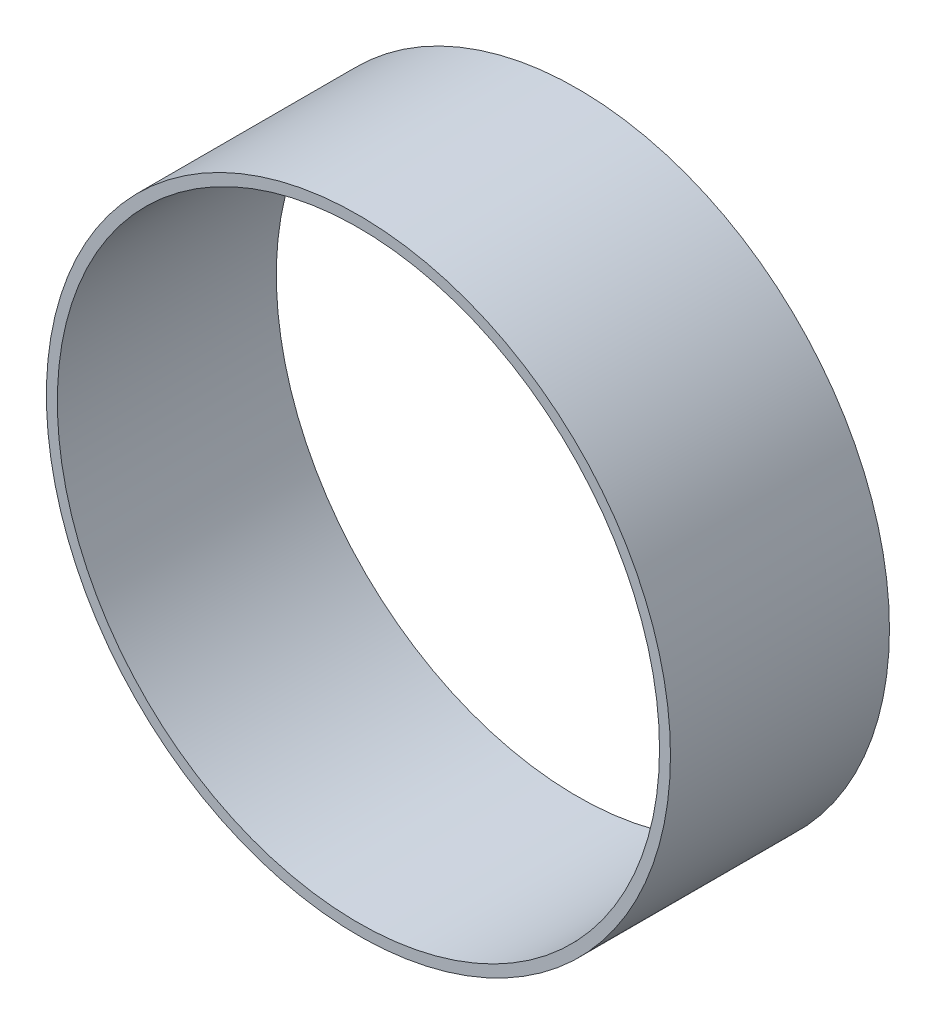
ISO-10303-21;
HEADER;
FILE_DESCRIPTION(('STEP AP214'),'2;1');
FILE_NAME('part.step','',(''),(''),'','','');
FILE_SCHEMA(('AUTOMOTIVE_DESIGN { 1 0 10303 214 1 1 1 1 }'));
ENDSEC;
DATA;
#1=APPLICATION_CONTEXT('core data for automotive mechanical design processes');
#2=APPLICATION_PROTOCOL_DEFINITION('international standard','automotive_design',2000,#1);
#3=PRODUCT_CONTEXT('',#1,'mechanical');
#4=PRODUCT('Part','Part','',(#3));
#5=PRODUCT_RELATED_PRODUCT_CATEGORY('part','',(#4));
#6=PRODUCT_DEFINITION_FORMATION('','',#4);
#7=PRODUCT_DEFINITION_CONTEXT('part definition',#1,'design');
#8=PRODUCT_DEFINITION('design','',#6,#7);
#9=PRODUCT_DEFINITION_SHAPE('','',#8);
#10=(LENGTH_UNIT() NAMED_UNIT(*) SI_UNIT(.MILLI.,.METRE.));
#11=(NAMED_UNIT(*) PLANE_ANGLE_UNIT() SI_UNIT($,.RADIAN.));
#12=(NAMED_UNIT(*) SI_UNIT($,.STERADIAN.) SOLID_ANGLE_UNIT());
#13=UNCERTAINTY_MEASURE_WITH_UNIT(LENGTH_MEASURE(1.E-05),#10,'distance_accuracy_value','');
#14=(GEOMETRIC_REPRESENTATION_CONTEXT(3) GLOBAL_UNCERTAINTY_ASSIGNED_CONTEXT((#13)) GLOBAL_UNIT_ASSIGNED_CONTEXT((#10,
#11,#12)) REPRESENTATION_CONTEXT('',''));
#15=CARTESIAN_POINT('',(0.,0.,0.));
#16=DIRECTION('',(0.,0.,1.));
#17=DIRECTION('',(1.,0.,0.));
#18=AXIS2_PLACEMENT_3D('',#15,#16,#17);
#19=CARTESIAN_POINT('',(0.,0.,40.));
#20=DIRECTION('',(0.,0.,1.));
#21=DIRECTION('',(1.,0.,0.));
#22=AXIS2_PLACEMENT_3D('',#19,#20,#21);
#23=PLANE('',#22);
#24=CARTESIAN_POINT('',(0.,0.,40.));
#25=DIRECTION('',(0.,0.,1.));
#26=DIRECTION('',(1.,0.,0.));
#27=AXIS2_PLACEMENT_3D('',#24,#25,#26);
#28=CIRCLE('',#27,57.);
#29=CARTESIAN_POINT('',(57.,0.,40.));
#30=VERTEX_POINT('',#29);
#31=EDGE_CURVE('E10',#30,#30,#28,.T.);
#32=ORIENTED_EDGE('',*,*,#31,.T.);
#33=EDGE_LOOP('',(#32));
#34=FACE_BOUND('',#33,.T.);
#35=CARTESIAN_POINT('',(0.,0.,40.));
#36=DIRECTION('',(0.,0.,1.));
#37=DIRECTION('',(1.,0.,0.));
#38=AXIS2_PLACEMENT_3D('',#35,#36,#37);
#39=CIRCLE('',#38,55.);
#40=CARTESIAN_POINT('',(55.,0.,40.));
#41=VERTEX_POINT('',#40);
#42=EDGE_CURVE('E42',#41,#41,#39,.T.);
#43=ORIENTED_EDGE('',*,*,#42,.F.);
#44=EDGE_LOOP('',(#43));
#45=FACE_BOUND('',#44,.T.);
#46=ADVANCED_FACE('F31',(#34,#45),#23,.T.);
#47=CARTESIAN_POINT('',(0.,0.,0.));
#48=DIRECTION('',(0.,0.,1.));
#49=DIRECTION('',(1.,0.,0.));
#50=AXIS2_PLACEMENT_3D('',#47,#48,#49);
#51=PLANE('',#50);
#52=CARTESIAN_POINT('',(0.,0.,0.));
#53=DIRECTION('',(0.,0.,1.));
#54=DIRECTION('',(1.,0.,0.));
#55=AXIS2_PLACEMENT_3D('',#52,#53,#54);
#56=CIRCLE('',#55,57.);
#57=CARTESIAN_POINT('',(57.,0.,0.));
#58=VERTEX_POINT('',#57);
#59=EDGE_CURVE('E35',#58,#58,#56,.T.);
#60=ORIENTED_EDGE('',*,*,#59,.F.);
#61=EDGE_LOOP('',(#60));
#62=FACE_BOUND('',#61,.T.);
#63=CARTESIAN_POINT('',(0.,0.,0.));
#64=DIRECTION('',(0.,0.,1.));
#65=DIRECTION('',(1.,0.,0.));
#66=AXIS2_PLACEMENT_3D('',#63,#64,#65);
#67=CIRCLE('',#66,55.);
#68=CARTESIAN_POINT('',(55.,0.,0.));
#69=VERTEX_POINT('',#68);
#70=EDGE_CURVE('E44',#69,#69,#67,.T.);
#71=ORIENTED_EDGE('',*,*,#70,.T.);
#72=EDGE_LOOP('',(#71));
#73=FACE_BOUND('',#72,.T.);
#74=ADVANCED_FACE('F54',(#62,#73),#51,.F.);
#75=CARTESIAN_POINT('',(0.,0.,40.));
#76=DIRECTION('',(0.,0.,-1.));
#77=DIRECTION('',(-1.,0.,0.));
#78=AXIS2_PLACEMENT_3D('',#75,#76,#77);
#79=CYLINDRICAL_SURFACE('',#78,57.);
#80=ORIENTED_EDGE('',*,*,#31,.F.);
#81=EDGE_LOOP('',(#80));
#82=FACE_BOUND('',#81,.T.);
#83=ORIENTED_EDGE('',*,*,#59,.T.);
#84=EDGE_LOOP('',(#83));
#85=FACE_BOUND('',#84,.T.);
#86=ADVANCED_FACE('F33',(#82,#85),#79,.T.);
#87=CARTESIAN_POINT('',(0.,0.,40.));
#88=DIRECTION('',(0.,0.,-1.));
#89=DIRECTION('',(-1.,0.,0.));
#90=AXIS2_PLACEMENT_3D('',#87,#88,#89);
#91=CYLINDRICAL_SURFACE('',#90,55.);
#92=ORIENTED_EDGE('',*,*,#42,.T.);
#93=EDGE_LOOP('',(#92));
#94=FACE_BOUND('',#93,.T.);
#95=ORIENTED_EDGE('',*,*,#70,.F.);
#96=EDGE_LOOP('',(#95));
#97=FACE_BOUND('',#96,.T.);
#98=ADVANCED_FACE('F50',(#94,#97),#91,.F.);
#99=CLOSED_SHELL('',(#46,#74,#86,#98));
#100=MANIFOLD_SOLID_BREP('B2',#99);
#101=ADVANCED_BREP_SHAPE_REPRESENTATION('',(#18,#100),#14);
#102=SHAPE_DEFINITION_REPRESENTATION(#9,#101);
ENDSEC;
END-ISO-10303-21;
